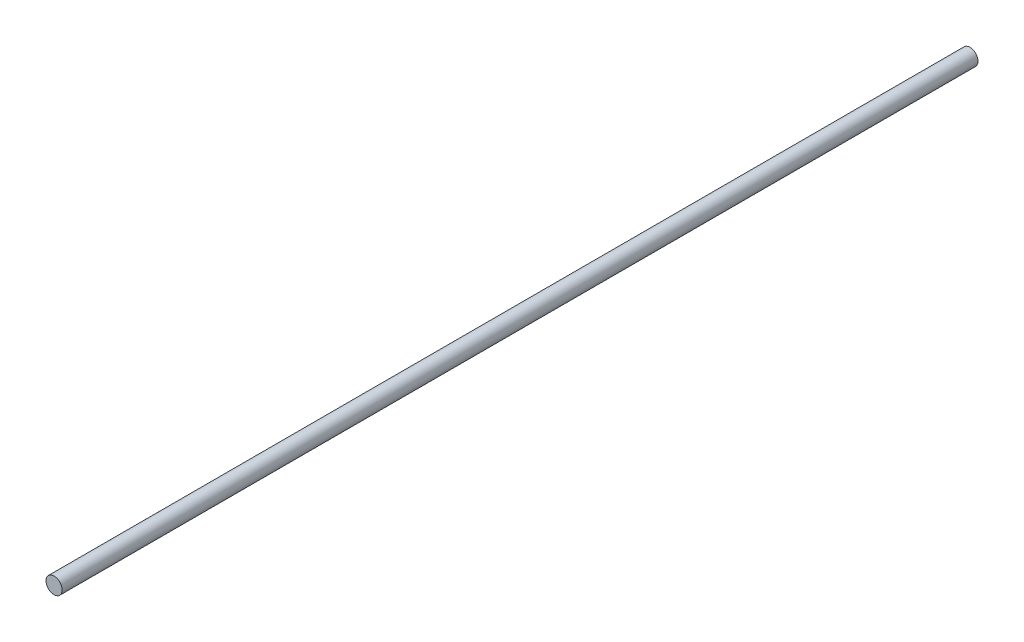
ISO-10303-21;
HEADER;
FILE_DESCRIPTION(('STEP AP214'),'2;1');
FILE_NAME('part.step','',(''),(''),'','','');
FILE_SCHEMA(('AUTOMOTIVE_DESIGN { 1 0 10303 214 1 1 1 1 }'));
ENDSEC;
DATA;
#1=APPLICATION_CONTEXT('core data for automotive mechanical design processes');
#2=APPLICATION_PROTOCOL_DEFINITION('international standard','automotive_design',2000,#1);
#3=PRODUCT_CONTEXT('',#1,'mechanical');
#4=PRODUCT('Part','Part','',(#3));
#5=PRODUCT_RELATED_PRODUCT_CATEGORY('part','',(#4));
#6=PRODUCT_DEFINITION_FORMATION('','',#4);
#7=PRODUCT_DEFINITION_CONTEXT('part definition',#1,'design');
#8=PRODUCT_DEFINITION('design','',#6,#7);
#9=PRODUCT_DEFINITION_SHAPE('','',#8);
#10=(LENGTH_UNIT() NAMED_UNIT(*) SI_UNIT(.MILLI.,.METRE.));
#11=(NAMED_UNIT(*) PLANE_ANGLE_UNIT() SI_UNIT($,.RADIAN.));
#12=(NAMED_UNIT(*) SI_UNIT($,.STERADIAN.) SOLID_ANGLE_UNIT());
#13=UNCERTAINTY_MEASURE_WITH_UNIT(LENGTH_MEASURE(1.E-05),#10,'distance_accuracy_value','');
#14=(GEOMETRIC_REPRESENTATION_CONTEXT(3) GLOBAL_UNCERTAINTY_ASSIGNED_CONTEXT((#13)) GLOBAL_UNIT_ASSIGNED_CONTEXT((#10,
#11,#12)) REPRESENTATION_CONTEXT('',''));
#15=CARTESIAN_POINT('',(0.,0.,0.));
#16=DIRECTION('',(0.,0.,1.));
#17=DIRECTION('',(1.,0.,0.));
#18=AXIS2_PLACEMENT_3D('',#15,#16,#17);
#19=CARTESIAN_POINT('',(0.,0.,850.));
#20=DIRECTION('',(0.,0.,-1.));
#21=DIRECTION('',(-1.,0.,0.));
#22=AXIS2_PLACEMENT_3D('',#19,#20,#21);
#23=CYLINDRICAL_SURFACE('',#22,7.5);
#24=CARTESIAN_POINT('',(0.,0.,850.));
#25=DIRECTION('',(0.,0.,1.));
#26=DIRECTION('',(1.,0.,0.));
#27=AXIS2_PLACEMENT_3D('',#24,#25,#26);
#28=CIRCLE('',#27,7.5);
#29=CARTESIAN_POINT('',(7.5,0.,850.));
#30=VERTEX_POINT('',#29);
#31=EDGE_CURVE('E10',#30,#30,#28,.T.);
#32=ORIENTED_EDGE('',*,*,#31,.F.);
#33=EDGE_LOOP('',(#32));
#34=FACE_BOUND('',#33,.T.);
#35=CARTESIAN_POINT('',(0.,0.,0.));
#36=DIRECTION('',(0.,0.,1.));
#37=DIRECTION('',(1.,0.,0.));
#38=AXIS2_PLACEMENT_3D('',#35,#36,#37);
#39=CIRCLE('',#38,7.5);
#40=CARTESIAN_POINT('',(7.5,0.,0.));
#41=VERTEX_POINT('',#40);
#42=EDGE_CURVE('E46',#41,#41,#39,.T.);
#43=ORIENTED_EDGE('',*,*,#42,.T.);
#44=EDGE_LOOP('',(#43));
#45=FACE_BOUND('',#44,.T.);
#46=ADVANCED_FACE('F43',(#34,#45),#23,.T.);
#47=CARTESIAN_POINT('',(0.,0.,850.));
#48=DIRECTION('',(0.,0.,1.));
#49=DIRECTION('',(1.,0.,0.));
#50=AXIS2_PLACEMENT_3D('',#47,#48,#49);
#51=PLANE('',#50);
#52=ORIENTED_EDGE('',*,*,#31,.T.);
#53=EDGE_LOOP('',(#52));
#54=FACE_BOUND('',#53,.T.);
#55=ADVANCED_FACE('F60',(#54),#51,.T.);
#56=CARTESIAN_POINT('',(0.,0.,0.));
#57=DIRECTION('',(0.,0.,1.));
#58=DIRECTION('',(1.,0.,0.));
#59=AXIS2_PLACEMENT_3D('',#56,#57,#58);
#60=PLANE('',#59);
#61=ORIENTED_EDGE('',*,*,#42,.F.);
#62=EDGE_LOOP('',(#61));
#63=FACE_BOUND('',#62,.T.);
#64=ADVANCED_FACE('F58',(#63),#60,.F.);
#65=CLOSED_SHELL('',(#46,#55,#64));
#66=MANIFOLD_SOLID_BREP('B2',#65);
#67=ADVANCED_BREP_SHAPE_REPRESENTATION('',(#18,#66),#14);
#68=SHAPE_DEFINITION_REPRESENTATION(#9,#67);
ENDSEC;
END-ISO-10303-21;
